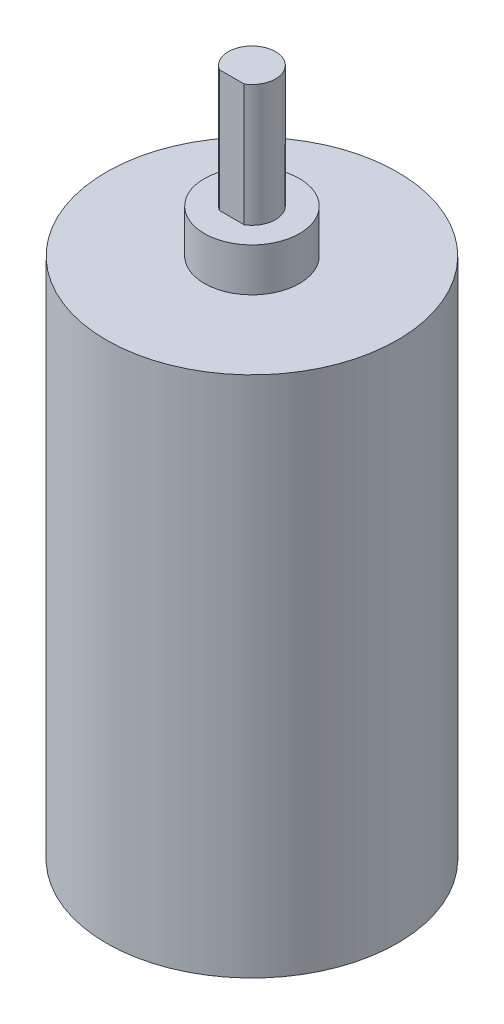
ISO-10303-21;
HEADER;
FILE_DESCRIPTION(('STEP AP214'),'2;1');
FILE_NAME('part.step','',(''),(''),'','','');
FILE_SCHEMA(('AUTOMOTIVE_DESIGN { 1 0 10303 214 1 1 1 1 }'));
ENDSEC;
DATA;
#1=APPLICATION_CONTEXT('core data for automotive mechanical design processes');
#2=APPLICATION_PROTOCOL_DEFINITION('international standard','automotive_design',2000,#1);
#3=PRODUCT_CONTEXT('',#1,'mechanical');
#4=PRODUCT('Part','Part','',(#3));
#5=PRODUCT_RELATED_PRODUCT_CATEGORY('part','',(#4));
#6=PRODUCT_DEFINITION_FORMATION('','',#4);
#7=PRODUCT_DEFINITION_CONTEXT('part definition',#1,'design');
#8=PRODUCT_DEFINITION('design','',#6,#7);
#9=PRODUCT_DEFINITION_SHAPE('','',#8);
#10=(LENGTH_UNIT() NAMED_UNIT(*) SI_UNIT(.MILLI.,.METRE.));
#11=(NAMED_UNIT(*) PLANE_ANGLE_UNIT() SI_UNIT($,.RADIAN.));
#12=(NAMED_UNIT(*) SI_UNIT($,.STERADIAN.) SOLID_ANGLE_UNIT());
#13=UNCERTAINTY_MEASURE_WITH_UNIT(LENGTH_MEASURE(1.E-05),#10,'distance_accuracy_value','');
#14=(GEOMETRIC_REPRESENTATION_CONTEXT(3) GLOBAL_UNCERTAINTY_ASSIGNED_CONTEXT((#13)) GLOBAL_UNIT_ASSIGNED_CONTEXT((#10,
#11,#12)) REPRESENTATION_CONTEXT('',''));
#15=CARTESIAN_POINT('',(0.,0.,0.));
#16=DIRECTION('',(0.,0.,1.));
#17=DIRECTION('',(1.,0.,0.));
#18=AXIS2_PLACEMENT_3D('',#15,#16,#17);
#19=CARTESIAN_POINT('',(0.,375.968837922861,-0.00496705894470201));
#20=DIRECTION('',(0.,1.,0.));
#21=DIRECTION('',(0.,0.,1.));
#22=AXIS2_PLACEMENT_3D('',#19,#20,#21);
#23=PLANE('',#22);
#24=CARTESIAN_POINT('',(0.,375.968837922861,-0.00496705894470201));
#25=DIRECTION('',(0.,1.,0.));
#26=DIRECTION('',(0.,0.,1.));
#27=AXIS2_PLACEMENT_3D('',#24,#25,#26);
#28=CIRCLE('',#27,6.05);
#29=CARTESIAN_POINT('',(0.,375.968837922861,6.0450329410553));
#30=VERTEX_POINT('',#29);
#31=EDGE_CURVE('E81',#30,#30,#28,.T.);
#32=ORIENTED_EDGE('',*,*,#31,.T.);
#33=EDGE_LOOP('',(#32));
#34=FACE_BOUND('',#33,.T.);
#35=CARTESIAN_POINT('',(0.,375.968837922861,-0.00496705894470201));
#36=DIRECTION('',(0.,1.,0.));
#37=DIRECTION('',(0.,0.,1.));
#38=AXIS2_PLACEMENT_3D('',#35,#36,#37);
#39=CIRCLE('',#38,3.);
#40=CARTESIAN_POINT('',(1.56994693952385,375.968837922861,2.55144969250247));
#41=VERTEX_POINT('',#40);
#42=CARTESIAN_POINT('',(-1.56994693952385,375.968837922861,2.55144969250246));
#43=VERTEX_POINT('',#42);
#44=EDGE_CURVE('E62',#41,#43,#39,.T.);
#45=ORIENTED_EDGE('',*,*,#44,.F.);
#46=DIRECTION('',(1.,0.,0.));
#47=VECTOR('',#46,1.);
#48=CARTESIAN_POINT('',(0.,375.968837922861,2.55144969250247));
#49=LINE('',#48,#47);
#50=EDGE_CURVE('E70',#43,#41,#49,.T.);
#51=ORIENTED_EDGE('',*,*,#50,.F.);
#52=EDGE_LOOP('',(#45,#51));
#53=FACE_BOUND('',#52,.T.);
#54=ADVANCED_FACE('F35',(#34,#53),#23,.T.);
#55=CARTESIAN_POINT('',(0.,370.468837922861,-0.00496705894470201));
#56=DIRECTION('',(0.,1.,0.));
#57=DIRECTION('',(0.,0.,1.));
#58=AXIS2_PLACEMENT_3D('',#55,#56,#57);
#59=PLANE('',#58);
#60=CARTESIAN_POINT('',(0.,370.468837922861,-0.00496705894470201));
#61=DIRECTION('',(0.,1.,0.));
#62=DIRECTION('',(0.,0.,1.));
#63=AXIS2_PLACEMENT_3D('',#60,#61,#62);
#64=CIRCLE('',#63,18.5);
#65=CARTESIAN_POINT('',(0.,370.468837922861,18.4950329410553));
#66=VERTEX_POINT('',#65);
#67=EDGE_CURVE('E11',#66,#66,#64,.T.);
#68=ORIENTED_EDGE('',*,*,#67,.T.);
#69=EDGE_LOOP('',(#68));
#70=FACE_BOUND('',#69,.T.);
#71=CARTESIAN_POINT('',(0.,370.468837922861,-0.00496705894470201));
#72=DIRECTION('',(0.,1.,0.));
#73=DIRECTION('',(0.,0.,1.));
#74=AXIS2_PLACEMENT_3D('',#71,#72,#73);
#75=CIRCLE('',#74,6.05);
#76=CARTESIAN_POINT('',(0.,370.468837922861,6.0450329410553));
#77=VERTEX_POINT('',#76);
#78=EDGE_CURVE('E80',#77,#77,#75,.T.);
#79=ORIENTED_EDGE('',*,*,#78,.F.);
#80=EDGE_LOOP('',(#79));
#81=FACE_BOUND('',#80,.T.);
#82=ADVANCED_FACE('F89',(#70,#81),#59,.T.);
#83=CARTESIAN_POINT('',(0.,370.468837922861,-0.00496705894470201));
#84=DIRECTION('',(0.,-1.,0.));
#85=DIRECTION('',(0.,0.,-1.));
#86=AXIS2_PLACEMENT_3D('',#83,#84,#85);
#87=CYLINDRICAL_SURFACE('',#86,18.5);
#88=ORIENTED_EDGE('',*,*,#67,.F.);
#89=EDGE_LOOP('',(#88));
#90=FACE_BOUND('',#89,.T.);
#91=CARTESIAN_POINT('',(0.,304.068837922861,-0.00496705894470201));
#92=DIRECTION('',(0.,1.,0.));
#93=DIRECTION('',(0.,0.,1.));
#94=AXIS2_PLACEMENT_3D('',#91,#92,#93);
#95=CIRCLE('',#94,18.5);
#96=CARTESIAN_POINT('',(0.,304.068837922861,18.4950329410553));
#97=VERTEX_POINT('',#96);
#98=EDGE_CURVE('E39',#97,#97,#95,.T.);
#99=ORIENTED_EDGE('',*,*,#98,.T.);
#100=EDGE_LOOP('',(#99));
#101=FACE_BOUND('',#100,.T.);
#102=ADVANCED_FACE('F37',(#90,#101),#87,.T.);
#103=CARTESIAN_POINT('',(0.,304.068837922861,-0.00496705894470201));
#104=DIRECTION('',(0.,1.,0.));
#105=DIRECTION('',(0.,0.,1.));
#106=AXIS2_PLACEMENT_3D('',#103,#104,#105);
#107=PLANE('',#106);
#108=ORIENTED_EDGE('',*,*,#98,.F.);
#109=EDGE_LOOP('',(#108));
#110=FACE_BOUND('',#109,.T.);
#111=ADVANCED_FACE('F97',(#110),#107,.F.);
#112=CARTESIAN_POINT('',(0.,375.968837922861,-0.00496705894470201));
#113=DIRECTION('',(0.,-1.,0.));
#114=DIRECTION('',(0.,0.,-1.));
#115=AXIS2_PLACEMENT_3D('',#112,#113,#114);
#116=CYLINDRICAL_SURFACE('',#115,6.05);
#117=ORIENTED_EDGE('',*,*,#31,.F.);
#118=EDGE_LOOP('',(#117));
#119=FACE_BOUND('',#118,.T.);
#120=ORIENTED_EDGE('',*,*,#78,.T.);
#121=EDGE_LOOP('',(#120));
#122=FACE_BOUND('',#121,.T.);
#123=ADVANCED_FACE('F87',(#119,#122),#116,.T.);
#124=CARTESIAN_POINT('',(0.,391.468837922861,2.55144969250247));
#125=DIRECTION('',(0.,0.,-1.));
#126=DIRECTION('',(-1.,0.,0.));
#127=AXIS2_PLACEMENT_3D('',#124,#125,#126);
#128=PLANE('',#127);
#129=ORIENTED_EDGE('',*,*,#50,.T.);
#130=DIRECTION('',(0.,-1.,0.));
#131=VECTOR('',#130,1.);
#132=CARTESIAN_POINT('',(1.56994693952385,391.468837922861,2.55144969250247));
#133=LINE('',#132,#131);
#134=CARTESIAN_POINT('',(1.56994693952385,391.468837922861,2.55144969250247));
#135=VERTEX_POINT('',#134);
#136=EDGE_CURVE('E50',#135,#41,#133,.T.);
#137=ORIENTED_EDGE('',*,*,#136,.F.);
#138=DIRECTION('',(1.,0.,0.));
#139=VECTOR('',#138,1.);
#140=CARTESIAN_POINT('',(0.,391.468837922861,2.55144969250247));
#141=LINE('',#140,#139);
#142=CARTESIAN_POINT('',(-1.56994693952385,391.468837922861,2.55144969250246));
#143=VERTEX_POINT('',#142);
#144=EDGE_CURVE('E69',#143,#135,#141,.T.);
#145=ORIENTED_EDGE('',*,*,#144,.F.);
#146=DIRECTION('',(0.,-1.,0.));
#147=VECTOR('',#146,1.);
#148=CARTESIAN_POINT('',(-1.56994693952385,391.468837922861,2.55144969250246));
#149=LINE('',#148,#147);
#150=EDGE_CURVE('E65',#143,#43,#149,.T.);
#151=ORIENTED_EDGE('',*,*,#150,.T.);
#152=EDGE_LOOP('',(#129,#137,#145,#151));
#153=FACE_BOUND('',#152,.T.);
#154=ADVANCED_FACE('F73',(#153),#128,.F.);
#155=CARTESIAN_POINT('',(0.,391.468837922861,-0.00496705894470201));
#156=DIRECTION('',(0.,-1.,0.));
#157=DIRECTION('',(0.,0.,-1.));
#158=AXIS2_PLACEMENT_3D('',#155,#156,#157);
#159=CYLINDRICAL_SURFACE('',#158,3.);
#160=ORIENTED_EDGE('',*,*,#44,.T.);
#161=ORIENTED_EDGE('',*,*,#150,.F.);
#162=CARTESIAN_POINT('',(0.,391.468837922861,-0.00496705894470201));
#163=DIRECTION('',(0.,1.,0.));
#164=DIRECTION('',(0.,0.,1.));
#165=AXIS2_PLACEMENT_3D('',#162,#163,#164);
#166=CIRCLE('',#165,3.);
#167=EDGE_CURVE('E57',#135,#143,#166,.T.);
#168=ORIENTED_EDGE('',*,*,#167,.F.);
#169=ORIENTED_EDGE('',*,*,#136,.T.);
#170=EDGE_LOOP('',(#160,#161,#168,#169));
#171=FACE_BOUND('',#170,.T.);
#172=ADVANCED_FACE('F64',(#171),#159,.T.);
#173=CARTESIAN_POINT('',(0.,391.468837922861,-0.00496705894470201));
#174=DIRECTION('',(0.,1.,0.));
#175=DIRECTION('',(0.,0.,1.));
#176=AXIS2_PLACEMENT_3D('',#173,#174,#175);
#177=PLANE('',#176);
#178=ORIENTED_EDGE('',*,*,#144,.T.);
#179=ORIENTED_EDGE('',*,*,#167,.T.);
#180=EDGE_LOOP('',(#178,#179));
#181=FACE_BOUND('',#180,.T.);
#182=ADVANCED_FACE('F119',(#181),#177,.T.);
#183=CLOSED_SHELL('',(#54,#82,#102,#111,#123,#154,#172,#182));
#184=MANIFOLD_SOLID_BREP('B2',#183);
#185=ADVANCED_BREP_SHAPE_REPRESENTATION('',(#18,#184),#14);
#186=SHAPE_DEFINITION_REPRESENTATION(#9,#185);
ENDSEC;
END-ISO-10303-21;
